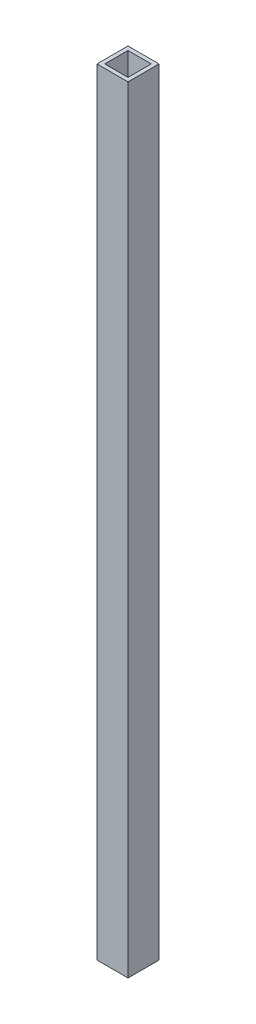
ISO-10303-21;
HEADER;
FILE_DESCRIPTION(('STEP AP214'),'2;1');
FILE_NAME('part.step','',(''),(''),'','','');
FILE_SCHEMA(('AUTOMOTIVE_DESIGN { 1 0 10303 214 1 1 1 1 }'));
ENDSEC;
DATA;
#1=APPLICATION_CONTEXT('core data for automotive mechanical design processes');
#2=APPLICATION_PROTOCOL_DEFINITION('international standard','automotive_design',2000,#1);
#3=PRODUCT_CONTEXT('',#1,'mechanical');
#4=PRODUCT('Part','Part','',(#3));
#5=PRODUCT_RELATED_PRODUCT_CATEGORY('part','',(#4));
#6=PRODUCT_DEFINITION_FORMATION('','',#4);
#7=PRODUCT_DEFINITION_CONTEXT('part definition',#1,'design');
#8=PRODUCT_DEFINITION('design','',#6,#7);
#9=PRODUCT_DEFINITION_SHAPE('','',#8);
#10=(LENGTH_UNIT() NAMED_UNIT(*) SI_UNIT(.MILLI.,.METRE.));
#11=(NAMED_UNIT(*) PLANE_ANGLE_UNIT() SI_UNIT($,.RADIAN.));
#12=(NAMED_UNIT(*) SI_UNIT($,.STERADIAN.) SOLID_ANGLE_UNIT());
#13=UNCERTAINTY_MEASURE_WITH_UNIT(LENGTH_MEASURE(1.E-05),#10,'distance_accuracy_value','');
#14=(GEOMETRIC_REPRESENTATION_CONTEXT(3) GLOBAL_UNCERTAINTY_ASSIGNED_CONTEXT((#13)) GLOBAL_UNIT_ASSIGNED_CONTEXT((#10,
#11,#12)) REPRESENTATION_CONTEXT('',''));
#15=CARTESIAN_POINT('',(0.,0.,0.));
#16=DIRECTION('',(0.,0.,1.));
#17=DIRECTION('',(1.,0.,0.));
#18=AXIS2_PLACEMENT_3D('',#15,#16,#17);
#19=CARTESIAN_POINT('',(0.,63.5,0.));
#20=DIRECTION('',(1.,0.,0.));
#21=DIRECTION('',(0.,0.,-1.));
#22=AXIS2_PLACEMENT_3D('',#19,#20,#21);
#23=PLANE('',#22);
#24=DIRECTION('',(0.,0.,1.));
#25=VECTOR('',#24,1.);
#26=CARTESIAN_POINT('',(0.,0.,0.));
#27=LINE('',#26,#25);
#28=CARTESIAN_POINT('',(0.,0.,-2.54));
#29=VERTEX_POINT('',#28);
#30=CARTESIAN_POINT('',(0.,0.,0.));
#31=VERTEX_POINT('',#30);
#32=EDGE_CURVE('E137',#29,#31,#27,.T.);
#33=ORIENTED_EDGE('',*,*,#32,.T.);
#34=DIRECTION('',(0.,-1.,0.));
#35=VECTOR('',#34,1.);
#36=CARTESIAN_POINT('',(0.,63.5,0.));
#37=LINE('',#36,#35);
#38=CARTESIAN_POINT('',(0.,63.5,0.));
#39=VERTEX_POINT('',#38);
#40=EDGE_CURVE('E11',#39,#31,#37,.T.);
#41=ORIENTED_EDGE('',*,*,#40,.F.);
#42=DIRECTION('',(0.,0.,1.));
#43=VECTOR('',#42,1.);
#44=CARTESIAN_POINT('',(0.,63.5,0.));
#45=LINE('',#44,#43);
#46=CARTESIAN_POINT('',(0.,63.5,-2.54));
#47=VERTEX_POINT('',#46);
#48=EDGE_CURVE('E142',#47,#39,#45,.T.);
#49=ORIENTED_EDGE('',*,*,#48,.F.);
#50=DIRECTION('',(0.,-1.,0.));
#51=VECTOR('',#50,1.);
#52=CARTESIAN_POINT('',(0.,63.5,-2.54));
#53=LINE('',#52,#51);
#54=EDGE_CURVE('E155',#47,#29,#53,.T.);
#55=ORIENTED_EDGE('',*,*,#54,.T.);
#56=EDGE_LOOP('',(#33,#41,#49,#55));
#57=FACE_BOUND('',#56,.T.);
#58=ADVANCED_FACE('F41',(#57),#23,.F.);
#59=CARTESIAN_POINT('',(0.,63.5,0.));
#60=DIRECTION('',(0.,0.,-1.));
#61=DIRECTION('',(-1.,0.,0.));
#62=AXIS2_PLACEMENT_3D('',#59,#60,#61);
#63=PLANE('',#62);
#64=DIRECTION('',(1.,0.,0.));
#65=VECTOR('',#64,1.);
#66=CARTESIAN_POINT('',(0.,0.,0.));
#67=LINE('',#66,#65);
#68=CARTESIAN_POINT('',(2.54,0.,0.));
#69=VERTEX_POINT('',#68);
#70=EDGE_CURVE('E154',#31,#69,#67,.T.);
#71=ORIENTED_EDGE('',*,*,#70,.T.);
#72=DIRECTION('',(0.,-1.,0.));
#73=VECTOR('',#72,1.);
#74=CARTESIAN_POINT('',(2.54,63.5,0.));
#75=LINE('',#74,#73);
#76=CARTESIAN_POINT('',(2.54,63.5,0.));
#77=VERTEX_POINT('',#76);
#78=EDGE_CURVE('E48',#77,#69,#75,.T.);
#79=ORIENTED_EDGE('',*,*,#78,.F.);
#80=DIRECTION('',(1.,0.,0.));
#81=VECTOR('',#80,1.);
#82=CARTESIAN_POINT('',(0.,63.5,0.));
#83=LINE('',#82,#81);
#84=EDGE_CURVE('E144',#39,#77,#83,.T.);
#85=ORIENTED_EDGE('',*,*,#84,.F.);
#86=ORIENTED_EDGE('',*,*,#40,.T.);
#87=EDGE_LOOP('',(#71,#79,#85,#86));
#88=FACE_BOUND('',#87,.T.);
#89=ADVANCED_FACE('F181',(#88),#63,.F.);
#90=CARTESIAN_POINT('',(2.54,63.5,0.));
#91=DIRECTION('',(-1.,0.,0.));
#92=DIRECTION('',(0.,0.,1.));
#93=AXIS2_PLACEMENT_3D('',#90,#91,#92);
#94=PLANE('',#93);
#95=DIRECTION('',(0.,0.,-1.));
#96=VECTOR('',#95,1.);
#97=CARTESIAN_POINT('',(2.54,0.,0.));
#98=LINE('',#97,#96);
#99=CARTESIAN_POINT('',(2.54,0.,-2.54));
#100=VERTEX_POINT('',#99);
#101=EDGE_CURVE('E160',#69,#100,#98,.T.);
#102=ORIENTED_EDGE('',*,*,#101,.T.);
#103=DIRECTION('',(0.,-1.,0.));
#104=VECTOR('',#103,1.);
#105=CARTESIAN_POINT('',(2.54,63.5,-2.54));
#106=LINE('',#105,#104);
#107=CARTESIAN_POINT('',(2.54,63.5,-2.54));
#108=VERTEX_POINT('',#107);
#109=EDGE_CURVE('E165',#108,#100,#106,.T.);
#110=ORIENTED_EDGE('',*,*,#109,.F.);
#111=DIRECTION('',(0.,0.,-1.));
#112=VECTOR('',#111,1.);
#113=CARTESIAN_POINT('',(2.54,63.5,0.));
#114=LINE('',#113,#112);
#115=EDGE_CURVE('E146',#77,#108,#114,.T.);
#116=ORIENTED_EDGE('',*,*,#115,.F.);
#117=ORIENTED_EDGE('',*,*,#78,.T.);
#118=EDGE_LOOP('',(#102,#110,#116,#117));
#119=FACE_BOUND('',#118,.T.);
#120=ADVANCED_FACE('F166',(#119),#94,.F.);
#121=CARTESIAN_POINT('',(0.,63.5,-2.54));
#122=DIRECTION('',(0.,0.,1.));
#123=DIRECTION('',(1.,0.,0.));
#124=AXIS2_PLACEMENT_3D('',#121,#122,#123);
#125=PLANE('',#124);
#126=DIRECTION('',(-1.,0.,0.));
#127=VECTOR('',#126,1.);
#128=CARTESIAN_POINT('',(0.,0.,-2.54));
#129=LINE('',#128,#127);
#130=EDGE_CURVE('E148',#100,#29,#129,.T.);
#131=ORIENTED_EDGE('',*,*,#130,.T.);
#132=ORIENTED_EDGE('',*,*,#54,.F.);
#133=DIRECTION('',(-1.,0.,0.));
#134=VECTOR('',#133,1.);
#135=CARTESIAN_POINT('',(0.,63.5,-2.54));
#136=LINE('',#135,#134);
#137=EDGE_CURVE('E147',#108,#47,#136,.T.);
#138=ORIENTED_EDGE('',*,*,#137,.F.);
#139=ORIENTED_EDGE('',*,*,#109,.T.);
#140=EDGE_LOOP('',(#131,#132,#138,#139));
#141=FACE_BOUND('',#140,.T.);
#142=ADVANCED_FACE('F176',(#141),#125,.F.);
#143=CARTESIAN_POINT('',(0.,63.5,0.));
#144=DIRECTION('',(0.,-1.,0.));
#145=DIRECTION('',(0.,0.,-1.));
#146=AXIS2_PLACEMENT_3D('',#143,#144,#145);
#147=PLANE('',#146);
#148=DIRECTION('',(1.,0.,0.));
#149=VECTOR('',#148,1.);
#150=CARTESIAN_POINT('',(0.3175,63.5,-0.3175));
#151=LINE('',#150,#149);
#152=CARTESIAN_POINT('',(0.3175,63.5,-0.3175));
#153=VERTEX_POINT('',#152);
#154=CARTESIAN_POINT('',(2.2225,63.5,-0.3175));
#155=VERTEX_POINT('',#154);
#156=EDGE_CURVE('E131',#153,#155,#151,.T.);
#157=ORIENTED_EDGE('',*,*,#156,.F.);
#158=DIRECTION('',(0.,0.,1.));
#159=VECTOR('',#158,1.);
#160=CARTESIAN_POINT('',(0.3175,63.5,-0.3175));
#161=LINE('',#160,#159);
#162=CARTESIAN_POINT('',(0.317499999999999,63.5,-2.2225));
#163=VERTEX_POINT('',#162);
#164=EDGE_CURVE('E54',#163,#153,#161,.T.);
#165=ORIENTED_EDGE('',*,*,#164,.F.);
#166=DIRECTION('',(-1.,0.,0.));
#167=VECTOR('',#166,1.);
#168=CARTESIAN_POINT('',(0.317499999999999,63.5,-2.2225));
#169=LINE('',#168,#167);
#170=CARTESIAN_POINT('',(2.2225,63.5,-2.2225));
#171=VERTEX_POINT('',#170);
#172=EDGE_CURVE('E122',#171,#163,#169,.T.);
#173=ORIENTED_EDGE('',*,*,#172,.F.);
#174=DIRECTION('',(0.,0.,-1.));
#175=VECTOR('',#174,1.);
#176=CARTESIAN_POINT('',(2.2225,63.5,-0.3175));
#177=LINE('',#176,#175);
#178=EDGE_CURVE('E127',#155,#171,#177,.T.);
#179=ORIENTED_EDGE('',*,*,#178,.F.);
#180=EDGE_LOOP('',(#157,#165,#173,#179));
#181=FACE_BOUND('',#180,.T.);
#182=ORIENTED_EDGE('',*,*,#48,.T.);
#183=ORIENTED_EDGE('',*,*,#84,.T.);
#184=ORIENTED_EDGE('',*,*,#115,.T.);
#185=ORIENTED_EDGE('',*,*,#137,.T.);
#186=EDGE_LOOP('',(#182,#183,#184,#185));
#187=FACE_BOUND('',#186,.T.);
#188=ADVANCED_FACE('F185',(#181,#187),#147,.F.);
#189=CARTESIAN_POINT('',(0.,0.,0.));
#190=DIRECTION('',(0.,-1.,0.));
#191=DIRECTION('',(0.,0.,-1.));
#192=AXIS2_PLACEMENT_3D('',#189,#190,#191);
#193=PLANE('',#192);
#194=DIRECTION('',(0.,0.,1.));
#195=VECTOR('',#194,1.);
#196=CARTESIAN_POINT('',(0.3175,0.,-0.3175));
#197=LINE('',#196,#195);
#198=CARTESIAN_POINT('',(0.317499999999999,0.,-2.2225));
#199=VERTEX_POINT('',#198);
#200=CARTESIAN_POINT('',(0.3175,0.,-0.3175));
#201=VERTEX_POINT('',#200);
#202=EDGE_CURVE('E110',#199,#201,#197,.T.);
#203=ORIENTED_EDGE('',*,*,#202,.T.);
#204=DIRECTION('',(1.,0.,0.));
#205=VECTOR('',#204,1.);
#206=CARTESIAN_POINT('',(0.3175,0.,-0.3175));
#207=LINE('',#206,#205);
#208=CARTESIAN_POINT('',(2.2225,0.,-0.3175));
#209=VERTEX_POINT('',#208);
#210=EDGE_CURVE('E119',#201,#209,#207,.T.);
#211=ORIENTED_EDGE('',*,*,#210,.T.);
#212=DIRECTION('',(0.,0.,-1.));
#213=VECTOR('',#212,1.);
#214=CARTESIAN_POINT('',(2.2225,0.,-0.3175));
#215=LINE('',#214,#213);
#216=CARTESIAN_POINT('',(2.2225,0.,-2.2225));
#217=VERTEX_POINT('',#216);
#218=EDGE_CURVE('E65',#209,#217,#215,.T.);
#219=ORIENTED_EDGE('',*,*,#218,.T.);
#220=DIRECTION('',(-1.,0.,0.));
#221=VECTOR('',#220,1.);
#222=CARTESIAN_POINT('',(0.317499999999999,0.,-2.2225));
#223=LINE('',#222,#221);
#224=EDGE_CURVE('E114',#217,#199,#223,.T.);
#225=ORIENTED_EDGE('',*,*,#224,.T.);
#226=EDGE_LOOP('',(#203,#211,#219,#225));
#227=FACE_BOUND('',#226,.T.);
#228=ORIENTED_EDGE('',*,*,#32,.F.);
#229=ORIENTED_EDGE('',*,*,#130,.F.);
#230=ORIENTED_EDGE('',*,*,#101,.F.);
#231=ORIENTED_EDGE('',*,*,#70,.F.);
#232=EDGE_LOOP('',(#228,#229,#230,#231));
#233=FACE_BOUND('',#232,.T.);
#234=ADVANCED_FACE('F117',(#227,#233),#193,.T.);
#235=CARTESIAN_POINT('',(0.3175,0.,-0.3175));
#236=DIRECTION('',(-1.,0.,0.));
#237=DIRECTION('',(0.,0.,1.));
#238=AXIS2_PLACEMENT_3D('',#235,#236,#237);
#239=PLANE('',#238);
#240=ORIENTED_EDGE('',*,*,#164,.T.);
#241=DIRECTION('',(0.,1.,0.));
#242=VECTOR('',#241,1.);
#243=CARTESIAN_POINT('',(0.3175,0.,-0.3175));
#244=LINE('',#243,#242);
#245=EDGE_CURVE('E103',#201,#153,#244,.T.);
#246=ORIENTED_EDGE('',*,*,#245,.F.);
#247=ORIENTED_EDGE('',*,*,#202,.F.);
#248=DIRECTION('',(0.,1.,0.));
#249=VECTOR('',#248,1.);
#250=CARTESIAN_POINT('',(0.317499999999999,0.,-2.2225));
#251=LINE('',#250,#249);
#252=EDGE_CURVE('E136',#199,#163,#251,.T.);
#253=ORIENTED_EDGE('',*,*,#252,.T.);
#254=EDGE_LOOP('',(#240,#246,#247,#253));
#255=FACE_BOUND('',#254,.T.);
#256=ADVANCED_FACE('F104',(#255),#239,.F.);
#257=CARTESIAN_POINT('',(0.317499999999999,0.,-2.2225));
#258=DIRECTION('',(0.,0.,-1.));
#259=DIRECTION('',(-1.,0.,0.));
#260=AXIS2_PLACEMENT_3D('',#257,#258,#259);
#261=PLANE('',#260);
#262=ORIENTED_EDGE('',*,*,#172,.T.);
#263=ORIENTED_EDGE('',*,*,#252,.F.);
#264=ORIENTED_EDGE('',*,*,#224,.F.);
#265=DIRECTION('',(0.,1.,0.));
#266=VECTOR('',#265,1.);
#267=CARTESIAN_POINT('',(2.2225,0.,-2.2225));
#268=LINE('',#267,#266);
#269=EDGE_CURVE('E138',#217,#171,#268,.T.);
#270=ORIENTED_EDGE('',*,*,#269,.T.);
#271=EDGE_LOOP('',(#262,#263,#264,#270));
#272=FACE_BOUND('',#271,.T.);
#273=ADVANCED_FACE('F199',(#272),#261,.F.);
#274=CARTESIAN_POINT('',(2.2225,0.,-0.3175));
#275=DIRECTION('',(1.,0.,0.));
#276=DIRECTION('',(0.,0.,-1.));
#277=AXIS2_PLACEMENT_3D('',#274,#275,#276);
#278=PLANE('',#277);
#279=ORIENTED_EDGE('',*,*,#178,.T.);
#280=ORIENTED_EDGE('',*,*,#269,.F.);
#281=ORIENTED_EDGE('',*,*,#218,.F.);
#282=DIRECTION('',(0.,1.,0.));
#283=VECTOR('',#282,1.);
#284=CARTESIAN_POINT('',(2.2225,0.,-0.3175));
#285=LINE('',#284,#283);
#286=EDGE_CURVE('E115',#209,#155,#285,.T.);
#287=ORIENTED_EDGE('',*,*,#286,.T.);
#288=EDGE_LOOP('',(#279,#280,#281,#287));
#289=FACE_BOUND('',#288,.T.);
#290=ADVANCED_FACE('F201',(#289),#278,.F.);
#291=CARTESIAN_POINT('',(0.3175,0.,-0.3175));
#292=DIRECTION('',(0.,0.,1.));
#293=DIRECTION('',(1.,0.,0.));
#294=AXIS2_PLACEMENT_3D('',#291,#292,#293);
#295=PLANE('',#294);
#296=ORIENTED_EDGE('',*,*,#156,.T.);
#297=ORIENTED_EDGE('',*,*,#286,.F.);
#298=ORIENTED_EDGE('',*,*,#210,.F.);
#299=ORIENTED_EDGE('',*,*,#245,.T.);
#300=EDGE_LOOP('',(#296,#297,#298,#299));
#301=FACE_BOUND('',#300,.T.);
#302=ADVANCED_FACE('F116',(#301),#295,.F.);
#303=CLOSED_SHELL('',(#58,#89,#120,#142,#188,#234,#256,#273,#290,#302));
#304=MANIFOLD_SOLID_BREP('B2',#303);
#305=ADVANCED_BREP_SHAPE_REPRESENTATION('',(#18,#304),#14);
#306=SHAPE_DEFINITION_REPRESENTATION(#9,#305);
ENDSEC;
END-ISO-10303-21;
